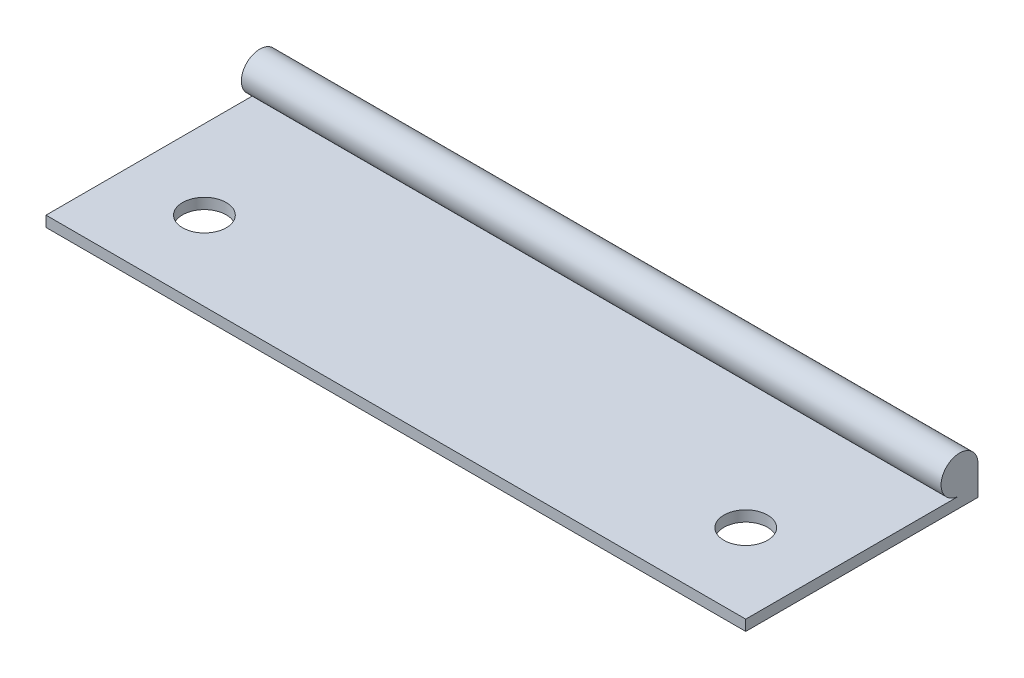
ISO-10303-21;
HEADER;
FILE_DESCRIPTION(('STEP AP214'),'2;1');
FILE_NAME('part.step','',(''),(''),'','','');
FILE_SCHEMA(('AUTOMOTIVE_DESIGN { 1 0 10303 214 1 1 1 1 }'));
ENDSEC;
DATA;
#1=APPLICATION_CONTEXT('core data for automotive mechanical design processes');
#2=APPLICATION_PROTOCOL_DEFINITION('international standard','automotive_design',2000,#1);
#3=PRODUCT_CONTEXT('',#1,'mechanical');
#4=PRODUCT('Part','Part','',(#3));
#5=PRODUCT_RELATED_PRODUCT_CATEGORY('part','',(#4));
#6=PRODUCT_DEFINITION_FORMATION('','',#4);
#7=PRODUCT_DEFINITION_CONTEXT('part definition',#1,'design');
#8=PRODUCT_DEFINITION('design','',#6,#7);
#9=PRODUCT_DEFINITION_SHAPE('','',#8);
#10=(LENGTH_UNIT() NAMED_UNIT(*) SI_UNIT(.MILLI.,.METRE.));
#11=(NAMED_UNIT(*) PLANE_ANGLE_UNIT() SI_UNIT($,.RADIAN.));
#12=(NAMED_UNIT(*) SI_UNIT($,.STERADIAN.) SOLID_ANGLE_UNIT());
#13=UNCERTAINTY_MEASURE_WITH_UNIT(LENGTH_MEASURE(1.E-05),#10,'distance_accuracy_value','');
#14=(GEOMETRIC_REPRESENTATION_CONTEXT(3) GLOBAL_UNCERTAINTY_ASSIGNED_CONTEXT((#13)) GLOBAL_UNIT_ASSIGNED_CONTEXT((#10,
#11,#12)) REPRESENTATION_CONTEXT('',''));
#15=CARTESIAN_POINT('',(0.,0.,0.));
#16=DIRECTION('',(0.,0.,1.));
#17=DIRECTION('',(1.,0.,0.));
#18=AXIS2_PLACEMENT_3D('',#15,#16,#17);
#19=CARTESIAN_POINT('',(72.,3.,-22.));
#20=DIRECTION('',(-1.,0.,0.));
#21=DIRECTION('',(0.,0.,1.));
#22=AXIS2_PLACEMENT_3D('',#19,#20,#21);
#23=CYLINDRICAL_SURFACE('',#22,1.9);
#24=CARTESIAN_POINT('',(0.,3.,-22.));
#25=DIRECTION('',(1.,0.,0.));
#26=DIRECTION('',(0.,0.,-1.));
#27=AXIS2_PLACEMENT_3D('',#24,#25,#26);
#28=CIRCLE('',#27,1.9);
#29=CARTESIAN_POINT('',(0.,3.,-23.9));
#30=VERTEX_POINT('',#29);
#31=CARTESIAN_POINT('',(0.,1.1,-22.));
#32=VERTEX_POINT('',#31);
#33=EDGE_CURVE('E110',#30,#32,#28,.T.);
#34=ORIENTED_EDGE('',*,*,#33,.T.);
#35=DIRECTION('',(-1.,0.,0.));
#36=VECTOR('',#35,1.);
#37=CARTESIAN_POINT('',(72.,1.1,-22.));
#38=LINE('',#37,#36);
#39=CARTESIAN_POINT('',(72.,1.1,-22.));
#40=VERTEX_POINT('',#39);
#41=EDGE_CURVE('E11',#40,#32,#38,.T.);
#42=ORIENTED_EDGE('',*,*,#41,.F.);
#43=CARTESIAN_POINT('',(72.,3.,-22.));
#44=DIRECTION('',(1.,0.,0.));
#45=DIRECTION('',(0.,0.,-1.));
#46=AXIS2_PLACEMENT_3D('',#43,#44,#45);
#47=CIRCLE('',#46,1.9);
#48=CARTESIAN_POINT('',(72.,3.,-23.9));
#49=VERTEX_POINT('',#48);
#50=EDGE_CURVE('E81',#49,#40,#47,.T.);
#51=ORIENTED_EDGE('',*,*,#50,.F.);
#52=DIRECTION('',(-1.,0.,0.));
#53=VECTOR('',#52,1.);
#54=CARTESIAN_POINT('',(72.,3.,-23.9));
#55=LINE('',#54,#53);
#56=EDGE_CURVE('E109',#49,#30,#55,.T.);
#57=ORIENTED_EDGE('',*,*,#56,.T.);
#58=EDGE_LOOP('',(#34,#42,#51,#57));
#59=FACE_BOUND('',#58,.T.);
#60=ADVANCED_FACE('F35',(#59),#23,.T.);
#61=CARTESIAN_POINT('',(72.,1.09999999999999,0.));
#62=DIRECTION('',(0.,1.,0.));
#63=DIRECTION('',(0.,0.,1.));
#64=AXIS2_PLACEMENT_3D('',#61,#62,#63);
#65=PLANE('',#64);
#66=CARTESIAN_POINT('',(63.85,1.09999999999999,-8.15));
#67=DIRECTION('',(0.,1.,0.));
#68=DIRECTION('',(0.,0.,1.));
#69=AXIS2_PLACEMENT_3D('',#66,#67,#68);
#70=CIRCLE('',#69,2.25);
#71=CARTESIAN_POINT('',(63.85,1.09999999999999,-5.9));
#72=VERTEX_POINT('',#71);
#73=EDGE_CURVE('E153',#72,#72,#70,.T.);
#74=ORIENTED_EDGE('',*,*,#73,.F.);
#75=EDGE_LOOP('',(#74));
#76=FACE_BOUND('',#75,.T.);
#77=CARTESIAN_POINT('',(8.15,1.09999999999999,-8.15));
#78=DIRECTION('',(0.,1.,0.));
#79=DIRECTION('',(0.,0.,1.));
#80=AXIS2_PLACEMENT_3D('',#77,#78,#79);
#81=CIRCLE('',#80,2.25);
#82=CARTESIAN_POINT('',(8.15,1.09999999999999,-5.9));
#83=VERTEX_POINT('',#82);
#84=EDGE_CURVE('E156',#83,#83,#81,.T.);
#85=ORIENTED_EDGE('',*,*,#84,.F.);
#86=EDGE_LOOP('',(#85));
#87=FACE_BOUND('',#86,.T.);
#88=DIRECTION('',(0.,0.,-1.));
#89=VECTOR('',#88,1.);
#90=CARTESIAN_POINT('',(0.,1.09999999999999,0.));
#91=LINE('',#90,#89);
#92=CARTESIAN_POINT('',(0.,1.1,0.));
#93=VERTEX_POINT('',#92);
#94=EDGE_CURVE('E113',#93,#32,#91,.T.);
#95=ORIENTED_EDGE('',*,*,#94,.F.);
#96=DIRECTION('',(-1.,0.,0.));
#97=VECTOR('',#96,1.);
#98=CARTESIAN_POINT('',(72.,1.1,0.));
#99=LINE('',#98,#97);
#100=CARTESIAN_POINT('',(72.,1.1,0.));
#101=VERTEX_POINT('',#100);
#102=EDGE_CURVE('E43',#101,#93,#99,.T.);
#103=ORIENTED_EDGE('',*,*,#102,.F.);
#104=DIRECTION('',(0.,0.,-1.));
#105=VECTOR('',#104,1.);
#106=CARTESIAN_POINT('',(72.,1.09999999999999,0.));
#107=LINE('',#106,#105);
#108=EDGE_CURVE('E103',#101,#40,#107,.T.);
#109=ORIENTED_EDGE('',*,*,#108,.T.);
#110=ORIENTED_EDGE('',*,*,#41,.T.);
#111=EDGE_LOOP('',(#95,#103,#109,#110));
#112=FACE_BOUND('',#111,.T.);
#113=ADVANCED_FACE('F123',(#76,#87,#112),#65,.T.);
#114=CARTESIAN_POINT('',(72.,0.,0.));
#115=DIRECTION('',(0.,0.,1.));
#116=DIRECTION('',(1.,0.,0.));
#117=AXIS2_PLACEMENT_3D('',#114,#115,#116);
#118=PLANE('',#117);
#119=DIRECTION('',(0.,1.,0.));
#120=VECTOR('',#119,1.);
#121=CARTESIAN_POINT('',(0.,0.,0.));
#122=LINE('',#121,#120);
#123=CARTESIAN_POINT('',(0.,0.,0.));
#124=VERTEX_POINT('',#123);
#125=EDGE_CURVE('E95',#124,#93,#122,.T.);
#126=ORIENTED_EDGE('',*,*,#125,.F.);
#127=DIRECTION('',(-1.,0.,0.));
#128=VECTOR('',#127,1.);
#129=CARTESIAN_POINT('',(72.,0.,0.));
#130=LINE('',#129,#128);
#131=CARTESIAN_POINT('',(72.,0.,0.));
#132=VERTEX_POINT('',#131);
#133=EDGE_CURVE('E89',#132,#124,#130,.T.);
#134=ORIENTED_EDGE('',*,*,#133,.F.);
#135=DIRECTION('',(0.,1.,0.));
#136=VECTOR('',#135,1.);
#137=CARTESIAN_POINT('',(72.,0.,0.));
#138=LINE('',#137,#136);
#139=EDGE_CURVE('E93',#132,#101,#138,.T.);
#140=ORIENTED_EDGE('',*,*,#139,.T.);
#141=ORIENTED_EDGE('',*,*,#102,.T.);
#142=EDGE_LOOP('',(#126,#134,#140,#141));
#143=FACE_BOUND('',#142,.T.);
#144=ADVANCED_FACE('F91',(#143),#118,.T.);
#145=CARTESIAN_POINT('',(72.,0.,0.));
#146=DIRECTION('',(0.,1.,0.));
#147=DIRECTION('',(0.,0.,1.));
#148=AXIS2_PLACEMENT_3D('',#145,#146,#147);
#149=PLANE('',#148);
#150=CARTESIAN_POINT('',(63.85,0.,-8.15));
#151=DIRECTION('',(0.,1.,0.));
#152=DIRECTION('',(0.,0.,1.));
#153=AXIS2_PLACEMENT_3D('',#150,#151,#152);
#154=CIRCLE('',#153,2.25);
#155=CARTESIAN_POINT('',(63.85,0.,-5.9));
#156=VERTEX_POINT('',#155);
#157=EDGE_CURVE('E158',#156,#156,#154,.T.);
#158=ORIENTED_EDGE('',*,*,#157,.T.);
#159=EDGE_LOOP('',(#158));
#160=FACE_BOUND('',#159,.T.);
#161=CARTESIAN_POINT('',(8.15,0.,-8.15));
#162=DIRECTION('',(0.,1.,0.));
#163=DIRECTION('',(0.,0.,1.));
#164=AXIS2_PLACEMENT_3D('',#161,#162,#163);
#165=CIRCLE('',#164,2.25);
#166=CARTESIAN_POINT('',(8.15,0.,-5.9));
#167=VERTEX_POINT('',#166);
#168=EDGE_CURVE('E114',#167,#167,#165,.T.);
#169=ORIENTED_EDGE('',*,*,#168,.T.);
#170=EDGE_LOOP('',(#169));
#171=FACE_BOUND('',#170,.T.);
#172=DIRECTION('',(0.,0.,-1.));
#173=VECTOR('',#172,1.);
#174=CARTESIAN_POINT('',(0.,0.,0.));
#175=LINE('',#174,#173);
#176=CARTESIAN_POINT('',(0.,0.,-23.9));
#177=VERTEX_POINT('',#176);
#178=EDGE_CURVE('E69',#124,#177,#175,.T.);
#179=ORIENTED_EDGE('',*,*,#178,.T.);
#180=DIRECTION('',(-1.,0.,0.));
#181=VECTOR('',#180,1.);
#182=CARTESIAN_POINT('',(72.,0.,-23.9));
#183=LINE('',#182,#181);
#184=CARTESIAN_POINT('',(72.,0.,-23.9));
#185=VERTEX_POINT('',#184);
#186=EDGE_CURVE('E96',#185,#177,#183,.T.);
#187=ORIENTED_EDGE('',*,*,#186,.F.);
#188=DIRECTION('',(0.,0.,-1.));
#189=VECTOR('',#188,1.);
#190=CARTESIAN_POINT('',(72.,0.,0.));
#191=LINE('',#190,#189);
#192=EDGE_CURVE('E98',#132,#185,#191,.T.);
#193=ORIENTED_EDGE('',*,*,#192,.F.);
#194=ORIENTED_EDGE('',*,*,#133,.T.);
#195=EDGE_LOOP('',(#179,#187,#193,#194));
#196=FACE_BOUND('',#195,.T.);
#197=ADVANCED_FACE('F99',(#160,#171,#196),#149,.F.);
#198=CARTESIAN_POINT('',(72.,0.,-23.9));
#199=DIRECTION('',(0.,0.,1.));
#200=DIRECTION('',(1.,0.,0.));
#201=AXIS2_PLACEMENT_3D('',#198,#199,#200);
#202=PLANE('',#201);
#203=DIRECTION('',(0.,1.,0.));
#204=VECTOR('',#203,1.);
#205=CARTESIAN_POINT('',(0.,0.,-23.9));
#206=LINE('',#205,#204);
#207=EDGE_CURVE('E75',#177,#30,#206,.T.);
#208=ORIENTED_EDGE('',*,*,#207,.T.);
#209=ORIENTED_EDGE('',*,*,#56,.F.);
#210=DIRECTION('',(0.,1.,0.));
#211=VECTOR('',#210,1.);
#212=CARTESIAN_POINT('',(72.,0.,-23.9));
#213=LINE('',#212,#211);
#214=EDGE_CURVE('E51',#185,#49,#213,.T.);
#215=ORIENTED_EDGE('',*,*,#214,.F.);
#216=ORIENTED_EDGE('',*,*,#186,.T.);
#217=EDGE_LOOP('',(#208,#209,#215,#216));
#218=FACE_BOUND('',#217,.T.);
#219=ADVANCED_FACE('F128',(#218),#202,.F.);
#220=CARTESIAN_POINT('',(72.,0.,0.));
#221=DIRECTION('',(1.,0.,0.));
#222=DIRECTION('',(0.,0.,-1.));
#223=AXIS2_PLACEMENT_3D('',#220,#221,#222);
#224=PLANE('',#223);
#225=ORIENTED_EDGE('',*,*,#50,.T.);
#226=ORIENTED_EDGE('',*,*,#108,.F.);
#227=ORIENTED_EDGE('',*,*,#139,.F.);
#228=ORIENTED_EDGE('',*,*,#192,.T.);
#229=ORIENTED_EDGE('',*,*,#214,.T.);
#230=EDGE_LOOP('',(#225,#226,#227,#228,#229));
#231=FACE_BOUND('',#230,.T.);
#232=ADVANCED_FACE('F101',(#231),#224,.T.);
#233=CARTESIAN_POINT('',(0.,0.,0.));
#234=DIRECTION('',(1.,0.,0.));
#235=DIRECTION('',(0.,0.,-1.));
#236=AXIS2_PLACEMENT_3D('',#233,#234,#235);
#237=PLANE('',#236);
#238=ORIENTED_EDGE('',*,*,#33,.F.);
#239=ORIENTED_EDGE('',*,*,#207,.F.);
#240=ORIENTED_EDGE('',*,*,#178,.F.);
#241=ORIENTED_EDGE('',*,*,#125,.T.);
#242=ORIENTED_EDGE('',*,*,#94,.T.);
#243=EDGE_LOOP('',(#238,#239,#240,#241,#242));
#244=FACE_BOUND('',#243,.T.);
#245=ADVANCED_FACE('F126',(#244),#237,.F.);
#246=CARTESIAN_POINT('',(8.15,0.,-8.15));
#247=DIRECTION('',(0.,1.,0.));
#248=DIRECTION('',(0.,0.,1.));
#249=AXIS2_PLACEMENT_3D('',#246,#247,#248);
#250=CYLINDRICAL_SURFACE('',#249,2.25);
#251=ORIENTED_EDGE('',*,*,#168,.F.);
#252=EDGE_LOOP('',(#251));
#253=FACE_BOUND('',#252,.T.);
#254=ORIENTED_EDGE('',*,*,#84,.T.);
#255=EDGE_LOOP('',(#254));
#256=FACE_BOUND('',#255,.T.);
#257=ADVANCED_FACE('F168',(#253,#256),#250,.F.);
#258=CARTESIAN_POINT('',(63.85,0.,-8.15));
#259=DIRECTION('',(0.,1.,0.));
#260=DIRECTION('',(0.,0.,1.));
#261=AXIS2_PLACEMENT_3D('',#258,#259,#260);
#262=CYLINDRICAL_SURFACE('',#261,2.25);
#263=ORIENTED_EDGE('',*,*,#157,.F.);
#264=EDGE_LOOP('',(#263));
#265=FACE_BOUND('',#264,.T.);
#266=ORIENTED_EDGE('',*,*,#73,.T.);
#267=EDGE_LOOP('',(#266));
#268=FACE_BOUND('',#267,.T.);
#269=ADVANCED_FACE('F166',(#265,#268),#262,.F.);
#270=CLOSED_SHELL('',(#60,#113,#144,#197,#219,#232,#245,#257,#269));
#271=MANIFOLD_SOLID_BREP('B2',#270);
#272=ADVANCED_BREP_SHAPE_REPRESENTATION('',(#18,#271),#14);
#273=SHAPE_DEFINITION_REPRESENTATION(#9,#272);
ENDSEC;
END-ISO-10303-21;
